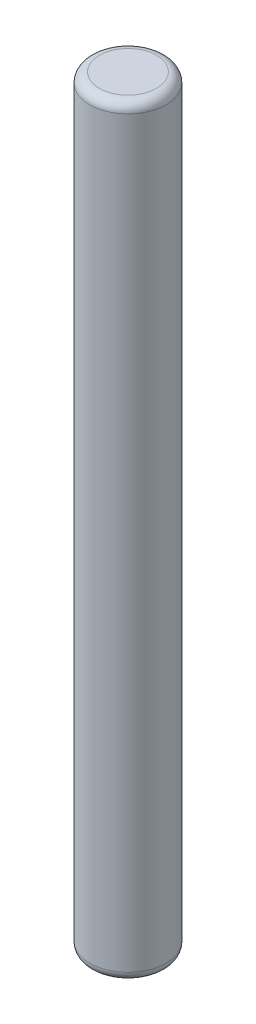
ISO-10303-21;
HEADER;
FILE_DESCRIPTION(('STEP AP214'),'2;1');
FILE_NAME('part.step','',(''),(''),'','','');
FILE_SCHEMA(('AUTOMOTIVE_DESIGN { 1 0 10303 214 1 1 1 1 }'));
ENDSEC;
DATA;
#1=APPLICATION_CONTEXT('core data for automotive mechanical design processes');
#2=APPLICATION_PROTOCOL_DEFINITION('international standard','automotive_design',2000,#1);
#3=PRODUCT_CONTEXT('',#1,'mechanical');
#4=PRODUCT('Part','Part','',(#3));
#5=PRODUCT_RELATED_PRODUCT_CATEGORY('part','',(#4));
#6=PRODUCT_DEFINITION_FORMATION('','',#4);
#7=PRODUCT_DEFINITION_CONTEXT('part definition',#1,'design');
#8=PRODUCT_DEFINITION('design','',#6,#7);
#9=PRODUCT_DEFINITION_SHAPE('','',#8);
#10=(LENGTH_UNIT() NAMED_UNIT(*) SI_UNIT(.MILLI.,.METRE.));
#11=(NAMED_UNIT(*) PLANE_ANGLE_UNIT() SI_UNIT($,.RADIAN.));
#12=(NAMED_UNIT(*) SI_UNIT($,.STERADIAN.) SOLID_ANGLE_UNIT());
#13=UNCERTAINTY_MEASURE_WITH_UNIT(LENGTH_MEASURE(1.E-05),#10,'distance_accuracy_value','');
#14=(GEOMETRIC_REPRESENTATION_CONTEXT(3) GLOBAL_UNCERTAINTY_ASSIGNED_CONTEXT((#13)) GLOBAL_UNIT_ASSIGNED_CONTEXT((#10,
#11,#12)) REPRESENTATION_CONTEXT('',''));
#15=CARTESIAN_POINT('',(0.,0.,0.));
#16=DIRECTION('',(0.,0.,1.));
#17=DIRECTION('',(1.,0.,0.));
#18=AXIS2_PLACEMENT_3D('',#15,#16,#17);
#19=CARTESIAN_POINT('',(0.,40.,0.));
#20=DIRECTION('',(0.,-1.,0.));
#21=DIRECTION('',(0.,0.,-1.));
#22=AXIS2_PLACEMENT_3D('',#19,#20,#21);
#23=CYLINDRICAL_SURFACE('',#22,2.);
#24=CARTESIAN_POINT('',(0.,0.5,0.));
#25=DIRECTION('',(0.,1.,0.));
#26=DIRECTION('',(0.,0.,1.));
#27=AXIS2_PLACEMENT_3D('',#24,#25,#26);
#28=CIRCLE('',#27,2.);
#29=CARTESIAN_POINT('',(0.,0.5,2.));
#30=VERTEX_POINT('',#29);
#31=EDGE_CURVE('E43',#30,#30,#28,.T.);
#32=ORIENTED_EDGE('',*,*,#31,.T.);
#33=EDGE_LOOP('',(#32));
#34=FACE_BOUND('',#33,.T.);
#35=CARTESIAN_POINT('',(0.,39.5,0.));
#36=DIRECTION('',(0.,1.,0.));
#37=DIRECTION('',(0.,0.,1.));
#38=AXIS2_PLACEMENT_3D('',#35,#36,#37);
#39=CIRCLE('',#38,2.);
#40=CARTESIAN_POINT('',(0.,39.5,2.));
#41=VERTEX_POINT('',#40);
#42=EDGE_CURVE('E47',#41,#41,#39,.F.);
#43=ORIENTED_EDGE('',*,*,#42,.T.);
#44=EDGE_LOOP('',(#43));
#45=FACE_BOUND('',#44,.T.);
#46=ADVANCED_FACE('F32',(#34,#45),#23,.T.);
#47=CARTESIAN_POINT('',(0.,40.,0.));
#48=DIRECTION('',(0.,1.,0.));
#49=DIRECTION('',(0.,0.,1.));
#50=AXIS2_PLACEMENT_3D('',#47,#48,#49);
#51=PLANE('',#50);
#52=CARTESIAN_POINT('',(0.,40.,0.));
#53=DIRECTION('',(0.,1.,0.));
#54=DIRECTION('',(0.,0.,1.));
#55=AXIS2_PLACEMENT_3D('',#52,#53,#54);
#56=CIRCLE('',#55,1.5);
#57=CARTESIAN_POINT('',(0.,40.,1.5));
#58=VERTEX_POINT('',#57);
#59=EDGE_CURVE('E10',#58,#58,#56,.T.);
#60=ORIENTED_EDGE('',*,*,#59,.T.);
#61=EDGE_LOOP('',(#60));
#62=FACE_BOUND('',#61,.T.);
#63=ADVANCED_FACE('F63',(#62),#51,.T.);
#64=CARTESIAN_POINT('',(0.,0.,0.));
#65=DIRECTION('',(0.,1.,0.));
#66=DIRECTION('',(0.,0.,1.));
#67=AXIS2_PLACEMENT_3D('',#64,#65,#66);
#68=PLANE('',#67);
#69=CARTESIAN_POINT('',(0.,0.,0.));
#70=DIRECTION('',(0.,1.,0.));
#71=DIRECTION('',(0.,0.,1.));
#72=AXIS2_PLACEMENT_3D('',#69,#70,#71);
#73=CIRCLE('',#72,1.5);
#74=CARTESIAN_POINT('',(0.,0.,1.5));
#75=VERTEX_POINT('',#74);
#76=EDGE_CURVE('E39',#75,#75,#73,.F.);
#77=ORIENTED_EDGE('',*,*,#76,.T.);
#78=EDGE_LOOP('',(#77));
#79=FACE_BOUND('',#78,.T.);
#80=ADVANCED_FACE('F60',(#79),#68,.F.);
#81=CARTESIAN_POINT('',(0.,0.5,0.));
#82=DIRECTION('',(0.,1.,0.));
#83=DIRECTION('',(0.,0.,1.));
#84=AXIS2_PLACEMENT_3D('',#81,#82,#83);
#85=TOROIDAL_SURFACE('',#84,1.5,0.5);
#86=ORIENTED_EDGE('',*,*,#76,.F.);
#87=EDGE_LOOP('',(#86));
#88=FACE_BOUND('',#87,.T.);
#89=ORIENTED_EDGE('',*,*,#31,.F.);
#90=EDGE_LOOP('',(#89));
#91=FACE_BOUND('',#90,.T.);
#92=ADVANCED_FACE('F56',(#88,#91),#85,.T.);
#93=CARTESIAN_POINT('',(0.,39.5,0.));
#94=DIRECTION('',(0.,1.,0.));
#95=DIRECTION('',(0.,0.,1.));
#96=AXIS2_PLACEMENT_3D('',#93,#94,#95);
#97=TOROIDAL_SURFACE('',#96,1.5,0.5);
#98=ORIENTED_EDGE('',*,*,#42,.F.);
#99=EDGE_LOOP('',(#98));
#100=FACE_BOUND('',#99,.T.);
#101=ORIENTED_EDGE('',*,*,#59,.F.);
#102=EDGE_LOOP('',(#101));
#103=FACE_BOUND('',#102,.T.);
#104=ADVANCED_FACE('F34',(#100,#103),#97,.T.);
#105=CLOSED_SHELL('',(#46,#63,#80,#92,#104));
#106=MANIFOLD_SOLID_BREP('B2',#105);
#107=ADVANCED_BREP_SHAPE_REPRESENTATION('',(#18,#106),#14);
#108=SHAPE_DEFINITION_REPRESENTATION(#9,#107);
ENDSEC;
END-ISO-10303-21;
